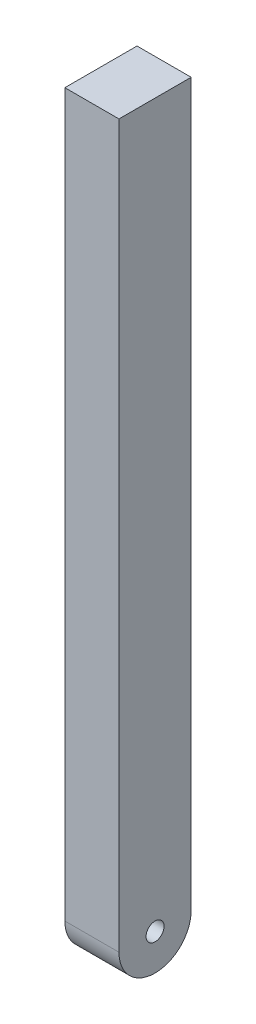
ISO-10303-21;
HEADER;
FILE_DESCRIPTION(('STEP AP214'),'2;1');
FILE_NAME('part.step','',(''),(''),'','','');
FILE_SCHEMA(('AUTOMOTIVE_DESIGN { 1 0 10303 214 1 1 1 1 }'));
ENDSEC;
DATA;
#1=APPLICATION_CONTEXT('core data for automotive mechanical design processes');
#2=APPLICATION_PROTOCOL_DEFINITION('international standard','automotive_design',2000,#1);
#3=PRODUCT_CONTEXT('',#1,'mechanical');
#4=PRODUCT('Part','Part','',(#3));
#5=PRODUCT_RELATED_PRODUCT_CATEGORY('part','',(#4));
#6=PRODUCT_DEFINITION_FORMATION('','',#4);
#7=PRODUCT_DEFINITION_CONTEXT('part definition',#1,'design');
#8=PRODUCT_DEFINITION('design','',#6,#7);
#9=PRODUCT_DEFINITION_SHAPE('','',#8);
#10=(LENGTH_UNIT() NAMED_UNIT(*) SI_UNIT(.MILLI.,.METRE.));
#11=(NAMED_UNIT(*) PLANE_ANGLE_UNIT() SI_UNIT($,.RADIAN.));
#12=(NAMED_UNIT(*) SI_UNIT($,.STERADIAN.) SOLID_ANGLE_UNIT());
#13=UNCERTAINTY_MEASURE_WITH_UNIT(LENGTH_MEASURE(1.E-05),#10,'distance_accuracy_value','');
#14=(GEOMETRIC_REPRESENTATION_CONTEXT(3) GLOBAL_UNCERTAINTY_ASSIGNED_CONTEXT((#13)) GLOBAL_UNIT_ASSIGNED_CONTEXT((#10,
#11,#12)) REPRESENTATION_CONTEXT('',''));
#15=CARTESIAN_POINT('',(0.,0.,0.));
#16=DIRECTION('',(0.,0.,1.));
#17=DIRECTION('',(1.,0.,0.));
#18=AXIS2_PLACEMENT_3D('',#15,#16,#17);
#19=CARTESIAN_POINT('',(15.,-100.,0.));
#20=DIRECTION('',(1.,0.,0.));
#21=DIRECTION('',(0.,0.,-1.));
#22=AXIS2_PLACEMENT_3D('',#19,#20,#21);
#23=PLANE('',#22);
#24=CARTESIAN_POINT('',(15.,-100.,0.));
#25=DIRECTION('',(1.,0.,0.));
#26=DIRECTION('',(0.,0.,-1.));
#27=AXIS2_PLACEMENT_3D('',#24,#25,#26);
#28=CIRCLE('',#27,10.);
#29=CARTESIAN_POINT('',(15.,-100.,9.99999999999998));
#30=VERTEX_POINT('',#29);
#31=CARTESIAN_POINT('',(15.,-100.,-10.));
#32=VERTEX_POINT('',#31);
#33=EDGE_CURVE('E85',#30,#32,#28,.T.);
#34=ORIENTED_EDGE('',*,*,#33,.T.);
#35=DIRECTION('',(0.,1.,0.));
#36=VECTOR('',#35,1.);
#37=CARTESIAN_POINT('',(15.,100.,-9.99999999999999));
#38=LINE('',#37,#36);
#39=CARTESIAN_POINT('',(15.,100.,-9.99999999999999));
#40=VERTEX_POINT('',#39);
#41=EDGE_CURVE('E80',#32,#40,#38,.T.);
#42=ORIENTED_EDGE('',*,*,#41,.T.);
#43=DIRECTION('',(0.,0.,1.));
#44=VECTOR('',#43,1.);
#45=CARTESIAN_POINT('',(15.,100.,-9.99999999999999));
#46=LINE('',#45,#44);
#47=CARTESIAN_POINT('',(15.,100.,10.));
#48=VERTEX_POINT('',#47);
#49=EDGE_CURVE('E83',#40,#48,#46,.T.);
#50=ORIENTED_EDGE('',*,*,#49,.T.);
#51=DIRECTION('',(0.,-1.,0.));
#52=VECTOR('',#51,1.);
#53=CARTESIAN_POINT('',(15.,100.,10.));
#54=LINE('',#53,#52);
#55=EDGE_CURVE('E50',#48,#30,#54,.T.);
#56=ORIENTED_EDGE('',*,*,#55,.T.);
#57=EDGE_LOOP('',(#34,#42,#50,#56));
#58=FACE_BOUND('',#57,.T.);
#59=CARTESIAN_POINT('',(15.,-100.,0.));
#60=DIRECTION('',(1.,0.,0.));
#61=DIRECTION('',(0.,0.,-1.));
#62=AXIS2_PLACEMENT_3D('',#59,#60,#61);
#63=CIRCLE('',#62,2.5);
#64=CARTESIAN_POINT('',(15.,-100.,-2.50000000000001));
#65=VERTEX_POINT('',#64);
#66=EDGE_CURVE('E100',#65,#65,#63,.T.);
#67=ORIENTED_EDGE('',*,*,#66,.F.);
#68=EDGE_LOOP('',(#67));
#69=FACE_BOUND('',#68,.T.);
#70=ADVANCED_FACE('F33',(#58,#69),#23,.T.);
#71=CARTESIAN_POINT('',(0.,-100.,0.));
#72=DIRECTION('',(1.,0.,0.));
#73=DIRECTION('',(0.,0.,-1.));
#74=AXIS2_PLACEMENT_3D('',#71,#72,#73);
#75=PLANE('',#74);
#76=CARTESIAN_POINT('',(0.,-100.,0.));
#77=DIRECTION('',(1.,0.,0.));
#78=DIRECTION('',(0.,0.,-1.));
#79=AXIS2_PLACEMENT_3D('',#76,#77,#78);
#80=CIRCLE('',#79,10.);
#81=CARTESIAN_POINT('',(0.,-100.,9.99999999999998));
#82=VERTEX_POINT('',#81);
#83=CARTESIAN_POINT('',(0.,-100.,-10.));
#84=VERTEX_POINT('',#83);
#85=EDGE_CURVE('E97',#82,#84,#80,.T.);
#86=ORIENTED_EDGE('',*,*,#85,.F.);
#87=DIRECTION('',(0.,-1.,0.));
#88=VECTOR('',#87,1.);
#89=CARTESIAN_POINT('',(0.,100.,10.));
#90=LINE('',#89,#88);
#91=CARTESIAN_POINT('',(0.,100.,10.));
#92=VERTEX_POINT('',#91);
#93=EDGE_CURVE('E73',#92,#82,#90,.T.);
#94=ORIENTED_EDGE('',*,*,#93,.F.);
#95=DIRECTION('',(0.,0.,1.));
#96=VECTOR('',#95,1.);
#97=CARTESIAN_POINT('',(0.,100.,-9.99999999999999));
#98=LINE('',#97,#96);
#99=CARTESIAN_POINT('',(0.,100.,-9.99999999999999));
#100=VERTEX_POINT('',#99);
#101=EDGE_CURVE('E67',#100,#92,#98,.T.);
#102=ORIENTED_EDGE('',*,*,#101,.F.);
#103=DIRECTION('',(0.,1.,0.));
#104=VECTOR('',#103,1.);
#105=CARTESIAN_POINT('',(0.,100.,-9.99999999999999));
#106=LINE('',#105,#104);
#107=EDGE_CURVE('E89',#84,#100,#106,.T.);
#108=ORIENTED_EDGE('',*,*,#107,.F.);
#109=EDGE_LOOP('',(#86,#94,#102,#108));
#110=FACE_BOUND('',#109,.T.);
#111=CARTESIAN_POINT('',(0.,-100.,0.));
#112=DIRECTION('',(1.,0.,0.));
#113=DIRECTION('',(0.,0.,-1.));
#114=AXIS2_PLACEMENT_3D('',#111,#112,#113);
#115=CIRCLE('',#114,2.5);
#116=CARTESIAN_POINT('',(0.,-100.,-2.50000000000001));
#117=VERTEX_POINT('',#116);
#118=EDGE_CURVE('E112',#117,#117,#115,.T.);
#119=ORIENTED_EDGE('',*,*,#118,.T.);
#120=EDGE_LOOP('',(#119));
#121=FACE_BOUND('',#120,.T.);
#122=ADVANCED_FACE('F108',(#110,#121),#75,.F.);
#123=CARTESIAN_POINT('',(15.,-100.,0.));
#124=DIRECTION('',(-1.,0.,0.));
#125=DIRECTION('',(0.,0.,1.));
#126=AXIS2_PLACEMENT_3D('',#123,#124,#125);
#127=CYLINDRICAL_SURFACE('',#126,10.);
#128=ORIENTED_EDGE('',*,*,#85,.T.);
#129=DIRECTION('',(-1.,0.,0.));
#130=VECTOR('',#129,1.);
#131=CARTESIAN_POINT('',(15.,-100.,-10.));
#132=LINE('',#131,#130);
#133=EDGE_CURVE('E11',#32,#84,#132,.T.);
#134=ORIENTED_EDGE('',*,*,#133,.F.);
#135=ORIENTED_EDGE('',*,*,#33,.F.);
#136=DIRECTION('',(-1.,0.,0.));
#137=VECTOR('',#136,1.);
#138=CARTESIAN_POINT('',(15.,-100.,9.99999999999998));
#139=LINE('',#138,#137);
#140=EDGE_CURVE('E93',#30,#82,#139,.T.);
#141=ORIENTED_EDGE('',*,*,#140,.T.);
#142=EDGE_LOOP('',(#128,#134,#135,#141));
#143=FACE_BOUND('',#142,.T.);
#144=ADVANCED_FACE('F35',(#143),#127,.T.);
#145=CARTESIAN_POINT('',(15.,100.,-9.99999999999999));
#146=DIRECTION('',(0.,0.,1.));
#147=DIRECTION('',(0.,-1.,0.));
#148=AXIS2_PLACEMENT_3D('',#145,#146,#147);
#149=PLANE('',#148);
#150=ORIENTED_EDGE('',*,*,#107,.T.);
#151=DIRECTION('',(-1.,0.,0.));
#152=VECTOR('',#151,1.);
#153=CARTESIAN_POINT('',(15.,100.,-9.99999999999999));
#154=LINE('',#153,#152);
#155=EDGE_CURVE('E42',#40,#100,#154,.T.);
#156=ORIENTED_EDGE('',*,*,#155,.F.);
#157=ORIENTED_EDGE('',*,*,#41,.F.);
#158=ORIENTED_EDGE('',*,*,#133,.T.);
#159=EDGE_LOOP('',(#150,#156,#157,#158));
#160=FACE_BOUND('',#159,.T.);
#161=ADVANCED_FACE('F88',(#160),#149,.F.);
#162=CARTESIAN_POINT('',(15.,100.,-9.99999999999999));
#163=DIRECTION('',(0.,-1.,0.));
#164=DIRECTION('',(0.,0.,-1.));
#165=AXIS2_PLACEMENT_3D('',#162,#163,#164);
#166=PLANE('',#165);
#167=ORIENTED_EDGE('',*,*,#101,.T.);
#168=DIRECTION('',(-1.,0.,0.));
#169=VECTOR('',#168,1.);
#170=CARTESIAN_POINT('',(15.,100.,10.));
#171=LINE('',#170,#169);
#172=EDGE_CURVE('E90',#48,#92,#171,.T.);
#173=ORIENTED_EDGE('',*,*,#172,.F.);
#174=ORIENTED_EDGE('',*,*,#49,.F.);
#175=ORIENTED_EDGE('',*,*,#155,.T.);
#176=EDGE_LOOP('',(#167,#173,#174,#175));
#177=FACE_BOUND('',#176,.T.);
#178=ADVANCED_FACE('F91',(#177),#166,.F.);
#179=CARTESIAN_POINT('',(15.,100.,10.));
#180=DIRECTION('',(0.,0.,-1.));
#181=DIRECTION('',(0.,1.,0.));
#182=AXIS2_PLACEMENT_3D('',#179,#180,#181);
#183=PLANE('',#182);
#184=ORIENTED_EDGE('',*,*,#93,.T.);
#185=ORIENTED_EDGE('',*,*,#140,.F.);
#186=ORIENTED_EDGE('',*,*,#55,.F.);
#187=ORIENTED_EDGE('',*,*,#172,.T.);
#188=EDGE_LOOP('',(#184,#185,#186,#187));
#189=FACE_BOUND('',#188,.T.);
#190=ADVANCED_FACE('F105',(#189),#183,.F.);
#191=CARTESIAN_POINT('',(15.,-100.,0.));
#192=DIRECTION('',(-1.,0.,0.));
#193=DIRECTION('',(0.,0.,1.));
#194=AXIS2_PLACEMENT_3D('',#191,#192,#193);
#195=CYLINDRICAL_SURFACE('',#194,2.5);
#196=ORIENTED_EDGE('',*,*,#66,.T.);
#197=EDGE_LOOP('',(#196));
#198=FACE_BOUND('',#197,.T.);
#199=ORIENTED_EDGE('',*,*,#118,.F.);
#200=EDGE_LOOP('',(#199));
#201=FACE_BOUND('',#200,.T.);
#202=ADVANCED_FACE('F118',(#198,#201),#195,.F.);
#203=CLOSED_SHELL('',(#70,#122,#144,#161,#178,#190,#202));
#204=MANIFOLD_SOLID_BREP('B2',#203);
#205=ADVANCED_BREP_SHAPE_REPRESENTATION('',(#18,#204),#14);
#206=SHAPE_DEFINITION_REPRESENTATION(#9,#205);
ENDSEC;
END-ISO-10303-21;
